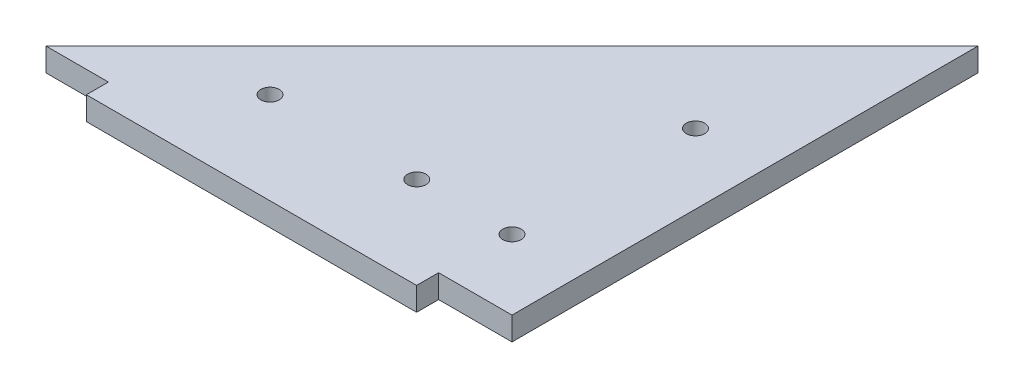
ISO-10303-21;
HEADER;
FILE_DESCRIPTION(('STEP AP214'),'2;1');
FILE_NAME('part.step','',(''),(''),'','','');
FILE_SCHEMA(('AUTOMOTIVE_DESIGN { 1 0 10303 214 1 1 1 1 }'));
ENDSEC;
DATA;
#1=APPLICATION_CONTEXT('core data for automotive mechanical design processes');
#2=APPLICATION_PROTOCOL_DEFINITION('international standard','automotive_design',2000,#1);
#3=PRODUCT_CONTEXT('',#1,'mechanical');
#4=PRODUCT('Part','Part','',(#3));
#5=PRODUCT_RELATED_PRODUCT_CATEGORY('part','',(#4));
#6=PRODUCT_DEFINITION_FORMATION('','',#4);
#7=PRODUCT_DEFINITION_CONTEXT('part definition',#1,'design');
#8=PRODUCT_DEFINITION('design','',#6,#7);
#9=PRODUCT_DEFINITION_SHAPE('','',#8);
#10=(LENGTH_UNIT() NAMED_UNIT(*) SI_UNIT(.MILLI.,.METRE.));
#11=(NAMED_UNIT(*) PLANE_ANGLE_UNIT() SI_UNIT($,.RADIAN.));
#12=(NAMED_UNIT(*) SI_UNIT($,.STERADIAN.) SOLID_ANGLE_UNIT());
#13=UNCERTAINTY_MEASURE_WITH_UNIT(LENGTH_MEASURE(1.E-05),#10,'distance_accuracy_value','');
#14=(GEOMETRIC_REPRESENTATION_CONTEXT(3) GLOBAL_UNCERTAINTY_ASSIGNED_CONTEXT((#13)) GLOBAL_UNIT_ASSIGNED_CONTEXT((#10,
#11,#12)) REPRESENTATION_CONTEXT('',''));
#15=CARTESIAN_POINT('',(0.,0.,0.));
#16=DIRECTION('',(0.,0.,1.));
#17=DIRECTION('',(1.,0.,0.));
#18=AXIS2_PLACEMENT_3D('',#15,#16,#17);
#19=CARTESIAN_POINT('',(0.,6.35,0.));
#20=DIRECTION('',(0.,-1.,0.));
#21=DIRECTION('',(0.,0.,-1.));
#22=AXIS2_PLACEMENT_3D('',#19,#20,#21);
#23=PLANE('',#22);
#24=DIRECTION('',(1.,0.,0.));
#25=VECTOR('',#24,1.);
#26=CARTESIAN_POINT('',(0.,6.35,0.));
#27=LINE('',#26,#25);
#28=CARTESIAN_POINT('',(0.,6.35,0.));
#29=VERTEX_POINT('',#28);
#30=CARTESIAN_POINT('',(17.,6.35,0.));
#31=VERTEX_POINT('',#30);
#32=EDGE_CURVE('E155',#29,#31,#27,.T.);
#33=ORIENTED_EDGE('',*,*,#32,.T.);
#34=DIRECTION('',(0.,0.,1.));
#35=VECTOR('',#34,1.);
#36=CARTESIAN_POINT('',(17.,6.35,0.));
#37=LINE('',#36,#35);
#38=CARTESIAN_POINT('',(17.,6.35,6.));
#39=VERTEX_POINT('',#38);
#40=EDGE_CURVE('E97',#31,#39,#37,.T.);
#41=ORIENTED_EDGE('',*,*,#40,.T.);
#42=DIRECTION('',(1.,0.,0.));
#43=VECTOR('',#42,1.);
#44=CARTESIAN_POINT('',(17.,6.35,6.));
#45=LINE('',#44,#43);
#46=CARTESIAN_POINT('',(107.,6.35,6.));
#47=VERTEX_POINT('',#46);
#48=EDGE_CURVE('E172',#39,#47,#45,.T.);
#49=ORIENTED_EDGE('',*,*,#48,.T.);
#50=DIRECTION('',(0.,0.,-1.));
#51=VECTOR('',#50,1.);
#52=CARTESIAN_POINT('',(107.,6.35,6.));
#53=LINE('',#52,#51);
#54=CARTESIAN_POINT('',(107.,6.35,0.));
#55=VERTEX_POINT('',#54);
#56=EDGE_CURVE('E113',#47,#55,#53,.T.);
#57=ORIENTED_EDGE('',*,*,#56,.T.);
#58=DIRECTION('',(1.,0.,0.));
#59=VECTOR('',#58,1.);
#60=CARTESIAN_POINT('',(107.,6.35,0.));
#61=LINE('',#60,#59);
#62=CARTESIAN_POINT('',(127.,6.35,0.));
#63=VERTEX_POINT('',#62);
#64=EDGE_CURVE('E107',#55,#63,#61,.T.);
#65=ORIENTED_EDGE('',*,*,#64,.T.);
#66=DIRECTION('',(0.,0.,-1.));
#67=VECTOR('',#66,1.);
#68=CARTESIAN_POINT('',(127.,6.35,0.));
#69=LINE('',#68,#67);
#70=CARTESIAN_POINT('',(127.,6.35,-127.));
#71=VERTEX_POINT('',#70);
#72=EDGE_CURVE('E111',#63,#71,#69,.T.);
#73=ORIENTED_EDGE('',*,*,#72,.T.);
#74=DIRECTION('',(-0.707106781186548,0.,0.707106781186548));
#75=VECTOR('',#74,1.);
#76=CARTESIAN_POINT('',(127.,6.35,-127.));
#77=LINE('',#76,#75);
#78=EDGE_CURVE('E57',#71,#29,#77,.T.);
#79=ORIENTED_EDGE('',*,*,#78,.T.);
#80=EDGE_LOOP('',(#33,#41,#49,#57,#65,#73,#79));
#81=FACE_BOUND('',#80,.T.);
#82=CARTESIAN_POINT('',(42.,6.35,-19.05));
#83=DIRECTION('',(0.,1.,0.));
#84=DIRECTION('',(0.,0.,1.));
#85=AXIS2_PLACEMENT_3D('',#82,#83,#84);
#86=CIRCLE('',#85,2.5);
#87=CARTESIAN_POINT('',(42.,6.35,-16.55));
#88=VERTEX_POINT('',#87);
#89=EDGE_CURVE('E140',#88,#88,#86,.T.);
#90=ORIENTED_EDGE('',*,*,#89,.F.);
#91=EDGE_LOOP('',(#90));
#92=FACE_BOUND('',#91,.T.);
#93=CARTESIAN_POINT('',(82.,6.35,-19.05));
#94=DIRECTION('',(0.,1.,0.));
#95=DIRECTION('',(0.,0.,1.));
#96=AXIS2_PLACEMENT_3D('',#93,#94,#95);
#97=CIRCLE('',#96,2.50000000000001);
#98=CARTESIAN_POINT('',(82.,6.35,-16.55));
#99=VERTEX_POINT('',#98);
#100=EDGE_CURVE('E192',#99,#99,#97,.T.);
#101=ORIENTED_EDGE('',*,*,#100,.F.);
#102=EDGE_LOOP('',(#101));
#103=FACE_BOUND('',#102,.T.);
#104=CARTESIAN_POINT('',(107.95,6.35,-19.05));
#105=DIRECTION('',(0.,1.,0.));
#106=DIRECTION('',(0.,0.,1.));
#107=AXIS2_PLACEMENT_3D('',#104,#105,#106);
#108=CIRCLE('',#107,2.50000000000001);
#109=CARTESIAN_POINT('',(107.95,6.35,-16.55));
#110=VERTEX_POINT('',#109);
#111=EDGE_CURVE('E200',#110,#110,#108,.T.);
#112=ORIENTED_EDGE('',*,*,#111,.F.);
#113=EDGE_LOOP('',(#112));
#114=FACE_BOUND('',#113,.T.);
#115=CARTESIAN_POINT('',(107.95,6.35,-69.05));
#116=DIRECTION('',(0.,1.,0.));
#117=DIRECTION('',(0.,0.,1.));
#118=AXIS2_PLACEMENT_3D('',#115,#116,#117);
#119=CIRCLE('',#118,2.50000000000001);
#120=CARTESIAN_POINT('',(107.95,6.35,-66.55));
#121=VERTEX_POINT('',#120);
#122=EDGE_CURVE('E208',#121,#121,#119,.T.);
#123=ORIENTED_EDGE('',*,*,#122,.F.);
#124=EDGE_LOOP('',(#123));
#125=FACE_BOUND('',#124,.T.);
#126=ADVANCED_FACE('F39',(#81,#92,#103,#114,#125),#23,.F.);
#127=CARTESIAN_POINT('',(0.,0.,0.));
#128=DIRECTION('',(0.,-1.,0.));
#129=DIRECTION('',(0.,0.,-1.));
#130=AXIS2_PLACEMENT_3D('',#127,#128,#129);
#131=PLANE('',#130);
#132=CARTESIAN_POINT('',(107.95,0.,-19.05));
#133=DIRECTION('',(0.,1.,0.));
#134=DIRECTION('',(0.,0.,1.));
#135=AXIS2_PLACEMENT_3D('',#132,#133,#134);
#136=CIRCLE('',#135,2.50000000000001);
#137=CARTESIAN_POINT('',(107.95,0.,-16.55));
#138=VERTEX_POINT('',#137);
#139=EDGE_CURVE('E204',#138,#138,#136,.T.);
#140=ORIENTED_EDGE('',*,*,#139,.T.);
#141=EDGE_LOOP('',(#140));
#142=FACE_BOUND('',#141,.T.);
#143=CARTESIAN_POINT('',(42.,0.,-19.05));
#144=DIRECTION('',(0.,1.,0.));
#145=DIRECTION('',(0.,0.,1.));
#146=AXIS2_PLACEMENT_3D('',#143,#144,#145);
#147=CIRCLE('',#146,2.5);
#148=CARTESIAN_POINT('',(42.,0.,-16.55));
#149=VERTEX_POINT('',#148);
#150=EDGE_CURVE('E188',#149,#149,#147,.T.);
#151=ORIENTED_EDGE('',*,*,#150,.T.);
#152=EDGE_LOOP('',(#151));
#153=FACE_BOUND('',#152,.T.);
#154=DIRECTION('',(1.,0.,0.));
#155=VECTOR('',#154,1.);
#156=CARTESIAN_POINT('',(0.,0.,0.));
#157=LINE('',#156,#155);
#158=CARTESIAN_POINT('',(0.,0.,0.));
#159=VERTEX_POINT('',#158);
#160=CARTESIAN_POINT('',(17.,0.,0.));
#161=VERTEX_POINT('',#160);
#162=EDGE_CURVE('E135',#159,#161,#157,.T.);
#163=ORIENTED_EDGE('',*,*,#162,.F.);
#164=DIRECTION('',(-0.707106781186548,0.,0.707106781186548));
#165=VECTOR('',#164,1.);
#166=CARTESIAN_POINT('',(127.,0.,-127.));
#167=LINE('',#166,#165);
#168=CARTESIAN_POINT('',(127.,0.,-127.));
#169=VERTEX_POINT('',#168);
#170=EDGE_CURVE('E89',#169,#159,#167,.T.);
#171=ORIENTED_EDGE('',*,*,#170,.F.);
#172=DIRECTION('',(0.,0.,-1.));
#173=VECTOR('',#172,1.);
#174=CARTESIAN_POINT('',(127.,0.,0.));
#175=LINE('',#174,#173);
#176=CARTESIAN_POINT('',(127.,0.,0.));
#177=VERTEX_POINT('',#176);
#178=EDGE_CURVE('E83',#177,#169,#175,.T.);
#179=ORIENTED_EDGE('',*,*,#178,.F.);
#180=DIRECTION('',(1.,0.,0.));
#181=VECTOR('',#180,1.);
#182=CARTESIAN_POINT('',(107.,0.,0.));
#183=LINE('',#182,#181);
#184=CARTESIAN_POINT('',(107.,0.,0.));
#185=VERTEX_POINT('',#184);
#186=EDGE_CURVE('E122',#185,#177,#183,.T.);
#187=ORIENTED_EDGE('',*,*,#186,.F.);
#188=DIRECTION('',(0.,0.,-1.));
#189=VECTOR('',#188,1.);
#190=CARTESIAN_POINT('',(107.,0.,6.));
#191=LINE('',#190,#189);
#192=CARTESIAN_POINT('',(107.,0.,6.));
#193=VERTEX_POINT('',#192);
#194=EDGE_CURVE('E146',#193,#185,#191,.T.);
#195=ORIENTED_EDGE('',*,*,#194,.F.);
#196=DIRECTION('',(1.,0.,0.));
#197=VECTOR('',#196,1.);
#198=CARTESIAN_POINT('',(17.,0.,6.));
#199=LINE('',#198,#197);
#200=CARTESIAN_POINT('',(17.,0.,6.));
#201=VERTEX_POINT('',#200);
#202=EDGE_CURVE('E143',#201,#193,#199,.T.);
#203=ORIENTED_EDGE('',*,*,#202,.F.);
#204=DIRECTION('',(0.,0.,1.));
#205=VECTOR('',#204,1.);
#206=CARTESIAN_POINT('',(17.,0.,0.));
#207=LINE('',#206,#205);
#208=EDGE_CURVE('E139',#161,#201,#207,.T.);
#209=ORIENTED_EDGE('',*,*,#208,.F.);
#210=EDGE_LOOP('',(#163,#171,#179,#187,#195,#203,#209));
#211=FACE_BOUND('',#210,.T.);
#212=CARTESIAN_POINT('',(82.,0.,-19.05));
#213=DIRECTION('',(0.,1.,0.));
#214=DIRECTION('',(0.,0.,1.));
#215=AXIS2_PLACEMENT_3D('',#212,#213,#214);
#216=CIRCLE('',#215,2.50000000000001);
#217=CARTESIAN_POINT('',(82.,0.,-16.55));
#218=VERTEX_POINT('',#217);
#219=EDGE_CURVE('E196',#218,#218,#216,.T.);
#220=ORIENTED_EDGE('',*,*,#219,.T.);
#221=EDGE_LOOP('',(#220));
#222=FACE_BOUND('',#221,.T.);
#223=CARTESIAN_POINT('',(107.95,0.,-69.05));
#224=DIRECTION('',(0.,1.,0.));
#225=DIRECTION('',(0.,0.,1.));
#226=AXIS2_PLACEMENT_3D('',#223,#224,#225);
#227=CIRCLE('',#226,2.50000000000001);
#228=CARTESIAN_POINT('',(107.95,0.,-66.55));
#229=VERTEX_POINT('',#228);
#230=EDGE_CURVE('E212',#229,#229,#227,.T.);
#231=ORIENTED_EDGE('',*,*,#230,.T.);
#232=EDGE_LOOP('',(#231));
#233=FACE_BOUND('',#232,.T.);
#234=ADVANCED_FACE('F176',(#142,#153,#211,#222,#233),#131,.T.);
#235=CARTESIAN_POINT('',(0.,6.35,0.));
#236=DIRECTION('',(0.,0.,-1.));
#237=DIRECTION('',(-1.,0.,0.));
#238=AXIS2_PLACEMENT_3D('',#235,#236,#237);
#239=PLANE('',#238);
#240=ORIENTED_EDGE('',*,*,#162,.T.);
#241=DIRECTION('',(0.,-1.,0.));
#242=VECTOR('',#241,1.);
#243=CARTESIAN_POINT('',(17.,6.35,0.));
#244=LINE('',#243,#242);
#245=EDGE_CURVE('E11',#31,#161,#244,.T.);
#246=ORIENTED_EDGE('',*,*,#245,.F.);
#247=ORIENTED_EDGE('',*,*,#32,.F.);
#248=DIRECTION('',(0.,-1.,0.));
#249=VECTOR('',#248,1.);
#250=CARTESIAN_POINT('',(0.,6.35,0.));
#251=LINE('',#250,#249);
#252=EDGE_CURVE('E131',#29,#159,#251,.T.);
#253=ORIENTED_EDGE('',*,*,#252,.T.);
#254=EDGE_LOOP('',(#240,#246,#247,#253));
#255=FACE_BOUND('',#254,.T.);
#256=ADVANCED_FACE('F41',(#255),#239,.F.);
#257=CARTESIAN_POINT('',(17.,6.35,0.));
#258=DIRECTION('',(1.,0.,0.));
#259=DIRECTION('',(0.,0.,-1.));
#260=AXIS2_PLACEMENT_3D('',#257,#258,#259);
#261=PLANE('',#260);
#262=ORIENTED_EDGE('',*,*,#208,.T.);
#263=DIRECTION('',(0.,-1.,0.));
#264=VECTOR('',#263,1.);
#265=CARTESIAN_POINT('',(17.,6.35,6.));
#266=LINE('',#265,#264);
#267=EDGE_CURVE('E49',#39,#201,#266,.T.);
#268=ORIENTED_EDGE('',*,*,#267,.F.);
#269=ORIENTED_EDGE('',*,*,#40,.F.);
#270=ORIENTED_EDGE('',*,*,#245,.T.);
#271=EDGE_LOOP('',(#262,#268,#269,#270));
#272=FACE_BOUND('',#271,.T.);
#273=ADVANCED_FACE('F244',(#272),#261,.F.);
#274=CARTESIAN_POINT('',(17.,6.35,6.));
#275=DIRECTION('',(0.,0.,-1.));
#276=DIRECTION('',(-1.,0.,0.));
#277=AXIS2_PLACEMENT_3D('',#274,#275,#276);
#278=PLANE('',#277);
#279=ORIENTED_EDGE('',*,*,#202,.T.);
#280=DIRECTION('',(0.,-1.,0.));
#281=VECTOR('',#280,1.);
#282=CARTESIAN_POINT('',(107.,6.35,6.));
#283=LINE('',#282,#281);
#284=EDGE_CURVE('E162',#47,#193,#283,.T.);
#285=ORIENTED_EDGE('',*,*,#284,.F.);
#286=ORIENTED_EDGE('',*,*,#48,.F.);
#287=ORIENTED_EDGE('',*,*,#267,.T.);
#288=EDGE_LOOP('',(#279,#285,#286,#287));
#289=FACE_BOUND('',#288,.T.);
#290=ADVANCED_FACE('F170',(#289),#278,.F.);
#291=CARTESIAN_POINT('',(107.,6.35,6.));
#292=DIRECTION('',(-1.,0.,0.));
#293=DIRECTION('',(0.,0.,1.));
#294=AXIS2_PLACEMENT_3D('',#291,#292,#293);
#295=PLANE('',#294);
#296=ORIENTED_EDGE('',*,*,#194,.T.);
#297=DIRECTION('',(0.,-1.,0.));
#298=VECTOR('',#297,1.);
#299=CARTESIAN_POINT('',(107.,6.35,0.));
#300=LINE('',#299,#298);
#301=EDGE_CURVE('E124',#55,#185,#300,.T.);
#302=ORIENTED_EDGE('',*,*,#301,.F.);
#303=ORIENTED_EDGE('',*,*,#56,.F.);
#304=ORIENTED_EDGE('',*,*,#284,.T.);
#305=EDGE_LOOP('',(#296,#302,#303,#304));
#306=FACE_BOUND('',#305,.T.);
#307=ADVANCED_FACE('F179',(#306),#295,.F.);
#308=CARTESIAN_POINT('',(107.,6.35,0.));
#309=DIRECTION('',(0.,0.,-1.));
#310=DIRECTION('',(-1.,0.,0.));
#311=AXIS2_PLACEMENT_3D('',#308,#309,#310);
#312=PLANE('',#311);
#313=ORIENTED_EDGE('',*,*,#186,.T.);
#314=DIRECTION('',(0.,-1.,0.));
#315=VECTOR('',#314,1.);
#316=CARTESIAN_POINT('',(127.,6.35,0.));
#317=LINE('',#316,#315);
#318=EDGE_CURVE('E119',#63,#177,#317,.T.);
#319=ORIENTED_EDGE('',*,*,#318,.F.);
#320=ORIENTED_EDGE('',*,*,#64,.F.);
#321=ORIENTED_EDGE('',*,*,#301,.T.);
#322=EDGE_LOOP('',(#313,#319,#320,#321));
#323=FACE_BOUND('',#322,.T.);
#324=ADVANCED_FACE('F120',(#323),#312,.F.);
#325=CARTESIAN_POINT('',(127.,6.35,0.));
#326=DIRECTION('',(-1.,0.,0.));
#327=DIRECTION('',(0.,0.,1.));
#328=AXIS2_PLACEMENT_3D('',#325,#326,#327);
#329=PLANE('',#328);
#330=ORIENTED_EDGE('',*,*,#178,.T.);
#331=DIRECTION('',(0.,-1.,0.));
#332=VECTOR('',#331,1.);
#333=CARTESIAN_POINT('',(127.,6.35,-127.));
#334=LINE('',#333,#332);
#335=EDGE_CURVE('E125',#71,#169,#334,.T.);
#336=ORIENTED_EDGE('',*,*,#335,.F.);
#337=ORIENTED_EDGE('',*,*,#72,.F.);
#338=ORIENTED_EDGE('',*,*,#318,.T.);
#339=EDGE_LOOP('',(#330,#336,#337,#338));
#340=FACE_BOUND('',#339,.T.);
#341=ADVANCED_FACE('F127',(#340),#329,.F.);
#342=CARTESIAN_POINT('',(127.,6.35,-127.));
#343=DIRECTION('',(0.707106781186548,0.,0.707106781186548));
#344=DIRECTION('',(0.707106781186548,0.,-0.707106781186548));
#345=AXIS2_PLACEMENT_3D('',#342,#343,#344);
#346=PLANE('',#345);
#347=ORIENTED_EDGE('',*,*,#170,.T.);
#348=ORIENTED_EDGE('',*,*,#252,.F.);
#349=ORIENTED_EDGE('',*,*,#78,.F.);
#350=ORIENTED_EDGE('',*,*,#335,.T.);
#351=EDGE_LOOP('',(#347,#348,#349,#350));
#352=FACE_BOUND('',#351,.T.);
#353=ADVANCED_FACE('F234',(#352),#346,.F.);
#354=CARTESIAN_POINT('',(42.,6.35,-19.05));
#355=DIRECTION('',(0.,-1.,0.));
#356=DIRECTION('',(0.,0.,-1.));
#357=AXIS2_PLACEMENT_3D('',#354,#355,#356);
#358=CYLINDRICAL_SURFACE('',#357,2.5);
#359=ORIENTED_EDGE('',*,*,#89,.T.);
#360=EDGE_LOOP('',(#359));
#361=FACE_BOUND('',#360,.T.);
#362=ORIENTED_EDGE('',*,*,#150,.F.);
#363=EDGE_LOOP('',(#362));
#364=FACE_BOUND('',#363,.T.);
#365=ADVANCED_FACE('F231',(#361,#364),#358,.F.);
#366=CARTESIAN_POINT('',(82.,6.35,-19.05));
#367=DIRECTION('',(0.,-1.,0.));
#368=DIRECTION('',(0.,0.,-1.));
#369=AXIS2_PLACEMENT_3D('',#366,#367,#368);
#370=CYLINDRICAL_SURFACE('',#369,2.50000000000001);
#371=ORIENTED_EDGE('',*,*,#100,.T.);
#372=EDGE_LOOP('',(#371));
#373=FACE_BOUND('',#372,.T.);
#374=ORIENTED_EDGE('',*,*,#219,.F.);
#375=EDGE_LOOP('',(#374));
#376=FACE_BOUND('',#375,.T.);
#377=ADVANCED_FACE('F303',(#373,#376),#370,.F.);
#378=CARTESIAN_POINT('',(107.95,6.35,-19.05));
#379=DIRECTION('',(0.,-1.,0.));
#380=DIRECTION('',(0.,0.,-1.));
#381=AXIS2_PLACEMENT_3D('',#378,#379,#380);
#382=CYLINDRICAL_SURFACE('',#381,2.50000000000001);
#383=ORIENTED_EDGE('',*,*,#111,.T.);
#384=EDGE_LOOP('',(#383));
#385=FACE_BOUND('',#384,.T.);
#386=ORIENTED_EDGE('',*,*,#139,.F.);
#387=EDGE_LOOP('',(#386));
#388=FACE_BOUND('',#387,.T.);
#389=ADVANCED_FACE('F311',(#385,#388),#382,.F.);
#390=CARTESIAN_POINT('',(107.95,6.35,-69.05));
#391=DIRECTION('',(0.,-1.,0.));
#392=DIRECTION('',(0.,0.,-1.));
#393=AXIS2_PLACEMENT_3D('',#390,#391,#392);
#394=CYLINDRICAL_SURFACE('',#393,2.50000000000001);
#395=ORIENTED_EDGE('',*,*,#122,.T.);
#396=EDGE_LOOP('',(#395));
#397=FACE_BOUND('',#396,.T.);
#398=ORIENTED_EDGE('',*,*,#230,.F.);
#399=EDGE_LOOP('',(#398));
#400=FACE_BOUND('',#399,.T.);
#401=ADVANCED_FACE('F220',(#397,#400),#394,.F.);
#402=CLOSED_SHELL('',(#126,#234,#256,#273,#290,#307,#324,#341,#353,#365,#377,#389,#401));
#403=MANIFOLD_SOLID_BREP('B2',#402);
#404=ADVANCED_BREP_SHAPE_REPRESENTATION('',(#18,#403),#14);
#405=SHAPE_DEFINITION_REPRESENTATION(#9,#404);
ENDSEC;
END-ISO-10303-21;
